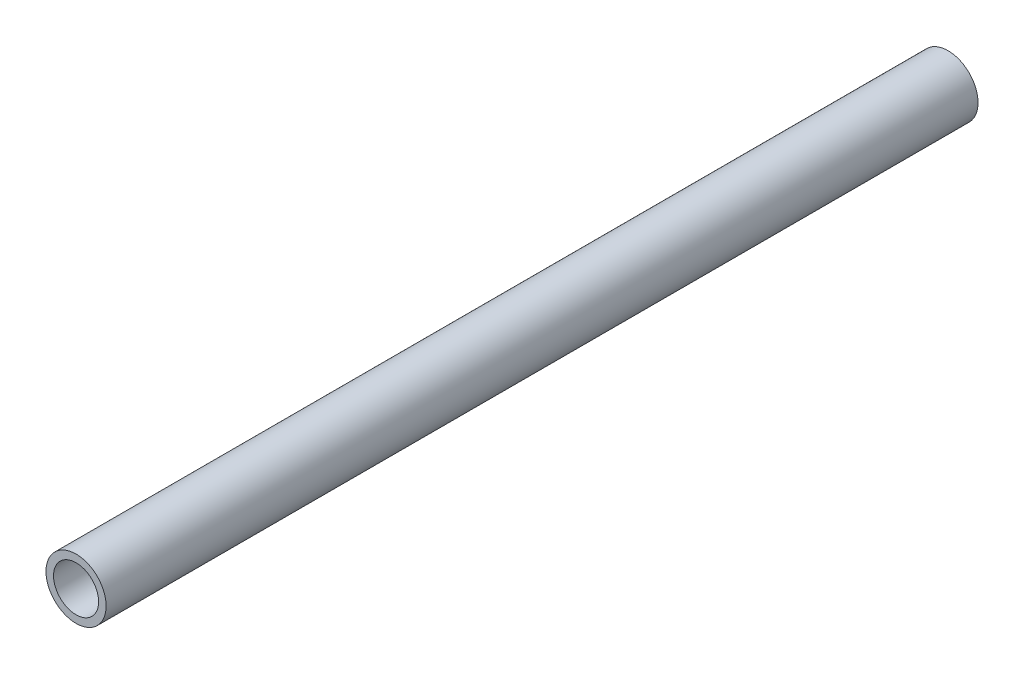
ISO-10303-21;
HEADER;
FILE_DESCRIPTION(('STEP AP214'),'2;1');
FILE_NAME('part.step','',(''),(''),'','','');
FILE_SCHEMA(('AUTOMOTIVE_DESIGN { 1 0 10303 214 1 1 1 1 }'));
ENDSEC;
DATA;
#1=APPLICATION_CONTEXT('core data for automotive mechanical design processes');
#2=APPLICATION_PROTOCOL_DEFINITION('international standard','automotive_design',2000,#1);
#3=PRODUCT_CONTEXT('',#1,'mechanical');
#4=PRODUCT('Part','Part','',(#3));
#5=PRODUCT_RELATED_PRODUCT_CATEGORY('part','',(#4));
#6=PRODUCT_DEFINITION_FORMATION('','',#4);
#7=PRODUCT_DEFINITION_CONTEXT('part definition',#1,'design');
#8=PRODUCT_DEFINITION('design','',#6,#7);
#9=PRODUCT_DEFINITION_SHAPE('','',#8);
#10=(LENGTH_UNIT() NAMED_UNIT(*) SI_UNIT(.MILLI.,.METRE.));
#11=(NAMED_UNIT(*) PLANE_ANGLE_UNIT() SI_UNIT($,.RADIAN.));
#12=(NAMED_UNIT(*) SI_UNIT($,.STERADIAN.) SOLID_ANGLE_UNIT());
#13=UNCERTAINTY_MEASURE_WITH_UNIT(LENGTH_MEASURE(1.E-05),#10,'distance_accuracy_value','');
#14=(GEOMETRIC_REPRESENTATION_CONTEXT(3) GLOBAL_UNCERTAINTY_ASSIGNED_CONTEXT((#13)) GLOBAL_UNIT_ASSIGNED_CONTEXT((#10,
#11,#12)) REPRESENTATION_CONTEXT('',''));
#15=CARTESIAN_POINT('',(0.,0.,0.));
#16=DIRECTION('',(0.,0.,1.));
#17=DIRECTION('',(1.,0.,0.));
#18=AXIS2_PLACEMENT_3D('',#15,#16,#17);
#19=CARTESIAN_POINT('',(0.,0.,29.));
#20=DIRECTION('',(0.,0.,1.));
#21=DIRECTION('',(1.,0.,0.));
#22=AXIS2_PLACEMENT_3D('',#19,#20,#21);
#23=PLANE('',#22);
#24=CARTESIAN_POINT('',(0.,0.,29.));
#25=DIRECTION('',(0.,0.,1.));
#26=DIRECTION('',(1.,0.,0.));
#27=AXIS2_PLACEMENT_3D('',#24,#25,#26);
#28=CIRCLE('',#27,2.);
#29=CARTESIAN_POINT('',(-2.,0.,29.));
#30=VERTEX_POINT('',#29);
#31=EDGE_CURVE('E10',#30,#30,#28,.T.);
#32=ORIENTED_EDGE('',*,*,#31,.T.);
#33=EDGE_LOOP('',(#32));
#34=FACE_BOUND('',#33,.T.);
#35=CARTESIAN_POINT('',(0.,0.,29.));
#36=DIRECTION('',(0.,0.,1.));
#37=DIRECTION('',(1.,0.,0.));
#38=AXIS2_PLACEMENT_3D('',#35,#36,#37);
#39=CIRCLE('',#38,1.5);
#40=CARTESIAN_POINT('',(-1.5,0.,29.));
#41=VERTEX_POINT('',#40);
#42=EDGE_CURVE('E43',#41,#41,#39,.T.);
#43=ORIENTED_EDGE('',*,*,#42,.F.);
#44=EDGE_LOOP('',(#43));
#45=FACE_BOUND('',#44,.T.);
#46=ADVANCED_FACE('F32',(#34,#45),#23,.T.);
#47=CARTESIAN_POINT('',(0.,0.,-29.));
#48=DIRECTION('',(0.,0.,1.));
#49=DIRECTION('',(1.,0.,0.));
#50=AXIS2_PLACEMENT_3D('',#47,#48,#49);
#51=PLANE('',#50);
#52=CARTESIAN_POINT('',(0.,0.,-29.));
#53=DIRECTION('',(0.,0.,1.));
#54=DIRECTION('',(1.,0.,0.));
#55=AXIS2_PLACEMENT_3D('',#52,#53,#54);
#56=CIRCLE('',#55,2.);
#57=CARTESIAN_POINT('',(-2.,0.,-29.));
#58=VERTEX_POINT('',#57);
#59=EDGE_CURVE('E36',#58,#58,#56,.T.);
#60=ORIENTED_EDGE('',*,*,#59,.F.);
#61=EDGE_LOOP('',(#60));
#62=FACE_BOUND('',#61,.T.);
#63=CARTESIAN_POINT('',(0.,0.,-29.));
#64=DIRECTION('',(0.,0.,1.));
#65=DIRECTION('',(1.,0.,0.));
#66=AXIS2_PLACEMENT_3D('',#63,#64,#65);
#67=CIRCLE('',#66,1.5);
#68=CARTESIAN_POINT('',(-1.5,0.,-29.));
#69=VERTEX_POINT('',#68);
#70=EDGE_CURVE('E45',#69,#69,#67,.T.);
#71=ORIENTED_EDGE('',*,*,#70,.T.);
#72=EDGE_LOOP('',(#71));
#73=FACE_BOUND('',#72,.T.);
#74=ADVANCED_FACE('F55',(#62,#73),#51,.F.);
#75=CARTESIAN_POINT('',(0.,0.,29.));
#76=DIRECTION('',(0.,0.,-1.));
#77=DIRECTION('',(-1.,0.,0.));
#78=AXIS2_PLACEMENT_3D('',#75,#76,#77);
#79=CYLINDRICAL_SURFACE('',#78,2.);
#80=CARTESIAN_POINT('',(-2.,0.,29.));
#81=CARTESIAN_POINT('',(-2.,0.,28.3958333333333));
#82=CARTESIAN_POINT('',(-2.,0.,27.7916666666667));
#83=CARTESIAN_POINT('',(-2.,0.,26.5833333333333));
#84=CARTESIAN_POINT('',(-2.,0.,25.9791666666667));
#85=CARTESIAN_POINT('',(-2.,0.,24.7708333333333));
#86=CARTESIAN_POINT('',(-2.,0.,24.1666666666667));
#87=CARTESIAN_POINT('',(-2.,0.,22.9583333333333));
#88=CARTESIAN_POINT('',(-2.,0.,22.3541666666667));
#89=CARTESIAN_POINT('',(-2.,0.,21.1458333333333));
#90=CARTESIAN_POINT('',(-2.,0.,20.5416666666667));
#91=CARTESIAN_POINT('',(-2.,0.,19.3333333333333));
#92=CARTESIAN_POINT('',(-2.,0.,18.7291666666667));
#93=CARTESIAN_POINT('',(-2.,0.,17.5208333333333));
#94=CARTESIAN_POINT('',(-2.,0.,16.9166666666667));
#95=CARTESIAN_POINT('',(-2.,0.,15.7083333333333));
#96=CARTESIAN_POINT('',(-2.,0.,15.1041666666667));
#97=CARTESIAN_POINT('',(-2.,0.,13.8958333333333));
#98=CARTESIAN_POINT('',(-2.,0.,13.2916666666667));
#99=CARTESIAN_POINT('',(-2.,0.,12.0833333333333));
#100=CARTESIAN_POINT('',(-2.,0.,11.4791666666667));
#101=CARTESIAN_POINT('',(-2.,0.,10.2708333333333));
#102=CARTESIAN_POINT('',(-2.,0.,9.66666666666667));
#103=CARTESIAN_POINT('',(-2.,0.,8.45833333333333));
#104=CARTESIAN_POINT('',(-2.,0.,7.85416666666667));
#105=CARTESIAN_POINT('',(-2.,0.,6.64583333333333));
#106=CARTESIAN_POINT('',(-2.,0.,6.04166666666667));
#107=CARTESIAN_POINT('',(-2.,0.,4.83333333333333));
#108=CARTESIAN_POINT('',(-2.,0.,4.22916666666667));
#109=CARTESIAN_POINT('',(-2.,0.,3.02083333333333));
#110=CARTESIAN_POINT('',(-2.,0.,2.41666666666667));
#111=CARTESIAN_POINT('',(-2.,0.,1.20833333333333));
#112=CARTESIAN_POINT('',(-2.,0.,0.604166666666667));
#113=CARTESIAN_POINT('',(-2.,0.,-0.604166666666667));
#114=CARTESIAN_POINT('',(-2.,0.,-1.20833333333333));
#115=CARTESIAN_POINT('',(-2.,0.,-2.41666666666667));
#116=CARTESIAN_POINT('',(-2.,0.,-3.02083333333333));
#117=CARTESIAN_POINT('',(-2.,0.,-4.22916666666667));
#118=CARTESIAN_POINT('',(-2.,0.,-4.83333333333333));
#119=CARTESIAN_POINT('',(-2.,0.,-6.04166666666666));
#120=CARTESIAN_POINT('',(-2.,0.,-6.64583333333333));
#121=CARTESIAN_POINT('',(-2.,0.,-7.85416666666666));
#122=CARTESIAN_POINT('',(-2.,0.,-8.45833333333333));
#123=CARTESIAN_POINT('',(-2.,0.,-9.66666666666667));
#124=CARTESIAN_POINT('',(-2.,0.,-10.2708333333333));
#125=CARTESIAN_POINT('',(-2.,0.,-11.4791666666667));
#126=CARTESIAN_POINT('',(-2.,0.,-12.0833333333333));
#127=CARTESIAN_POINT('',(-2.,0.,-13.2916666666667));
#128=CARTESIAN_POINT('',(-2.,0.,-13.8958333333333));
#129=CARTESIAN_POINT('',(-2.,0.,-15.1041666666667));
#130=CARTESIAN_POINT('',(-2.,0.,-15.7083333333333));
#131=CARTESIAN_POINT('',(-2.,0.,-16.9166666666667));
#132=CARTESIAN_POINT('',(-2.,0.,-17.5208333333333));
#133=CARTESIAN_POINT('',(-2.,0.,-18.7291666666667));
#134=CARTESIAN_POINT('',(-2.,0.,-19.3333333333333));
#135=CARTESIAN_POINT('',(-2.,0.,-20.5416666666667));
#136=CARTESIAN_POINT('',(-2.,0.,-21.1458333333333));
#137=CARTESIAN_POINT('',(-2.,0.,-22.3541666666667));
#138=CARTESIAN_POINT('',(-2.,0.,-22.9583333333333));
#139=CARTESIAN_POINT('',(-2.,0.,-24.1666666666667));
#140=CARTESIAN_POINT('',(-2.,0.,-24.7708333333333));
#141=CARTESIAN_POINT('',(-2.,0.,-25.9791666666667));
#142=CARTESIAN_POINT('',(-2.,0.,-26.5833333333333));
#143=CARTESIAN_POINT('',(-2.,0.,-27.7916666666667));
#144=CARTESIAN_POINT('',(-2.,0.,-28.3958333333333));
#145=CARTESIAN_POINT('',(-2.,0.,-29.));
#146=B_SPLINE_CURVE_WITH_KNOTS('',3,(#80,#81,#82,#83,#84,#85,#86,#87,#88,#89,#90,#91,#92,#93,
#94,#95,#96,#97,#98,#99,#100,#101,#102,#103,#104,#105,#106,#107,#108,#109,#110,#111,#112,#113,
#114,#115,#116,#117,#118,#119,#120,#121,#122,#123,#124,#125,#126,#127,#128,#129,#130,#131,#132,
#133,#134,#135,#136,#137,#138,#139,#140,#141,#142,#143,#144,#145),.UNSPECIFIED.,.F.,.F.,(4,2,2,
2,2,2,2,2,2,2,2,2,2,2,2,2,2,2,2,2,2,2,2,2,2,2,2,2,2,2,2,2,4),(0.,1.8125,3.625,5.4375,7.25,
9.0625,10.875,12.6875,14.5,16.3125,18.125,19.9375,21.75,23.5625,25.375,27.1875,29.,30.8125,
32.625,34.4375,36.25,38.0625,39.875,41.6875,43.5,45.3125,47.125,48.9375,50.75,52.5625,54.375,
56.1875,58.),.UNSPECIFIED.);
#147=EDGE_CURVE('BSEAM34',#30,#58,#146,.T.);
#148=ORIENTED_EDGE('',*,*,#31,.F.);
#149=ORIENTED_EDGE('',*,*,#59,.T.);
#150=ORIENTED_EDGE('',*,*,#147,.T.);
#151=ORIENTED_EDGE('',*,*,#147,.F.);
#152=EDGE_LOOP('',(#148,#150,#149,#151));
#153=FACE_BOUND('',#152,.T.);
#154=ADVANCED_FACE('F34',(#153),#79,.T.);
#155=CARTESIAN_POINT('',(0.,0.,29.));
#156=DIRECTION('',(0.,0.,-1.));
#157=DIRECTION('',(-1.,0.,0.));
#158=AXIS2_PLACEMENT_3D('',#155,#156,#157);
#159=CYLINDRICAL_SURFACE('',#158,1.5);
#160=CARTESIAN_POINT('',(-1.5,0.,29.));
#161=CARTESIAN_POINT('',(-1.5,0.,28.3958333333333));
#162=CARTESIAN_POINT('',(-1.5,0.,27.7916666666667));
#163=CARTESIAN_POINT('',(-1.5,0.,26.5833333333333));
#164=CARTESIAN_POINT('',(-1.5,0.,25.9791666666667));
#165=CARTESIAN_POINT('',(-1.5,0.,24.7708333333333));
#166=CARTESIAN_POINT('',(-1.5,0.,24.1666666666667));
#167=CARTESIAN_POINT('',(-1.5,0.,22.9583333333333));
#168=CARTESIAN_POINT('',(-1.5,0.,22.3541666666667));
#169=CARTESIAN_POINT('',(-1.5,0.,21.1458333333333));
#170=CARTESIAN_POINT('',(-1.5,0.,20.5416666666667));
#171=CARTESIAN_POINT('',(-1.5,0.,19.3333333333333));
#172=CARTESIAN_POINT('',(-1.5,0.,18.7291666666667));
#173=CARTESIAN_POINT('',(-1.5,0.,17.5208333333333));
#174=CARTESIAN_POINT('',(-1.5,0.,16.9166666666667));
#175=CARTESIAN_POINT('',(-1.5,0.,15.7083333333333));
#176=CARTESIAN_POINT('',(-1.5,0.,15.1041666666667));
#177=CARTESIAN_POINT('',(-1.5,0.,13.8958333333333));
#178=CARTESIAN_POINT('',(-1.5,0.,13.2916666666667));
#179=CARTESIAN_POINT('',(-1.5,0.,12.0833333333333));
#180=CARTESIAN_POINT('',(-1.5,0.,11.4791666666667));
#181=CARTESIAN_POINT('',(-1.5,0.,10.2708333333333));
#182=CARTESIAN_POINT('',(-1.5,0.,9.66666666666667));
#183=CARTESIAN_POINT('',(-1.5,0.,8.45833333333333));
#184=CARTESIAN_POINT('',(-1.5,0.,7.85416666666666));
#185=CARTESIAN_POINT('',(-1.5,0.,6.64583333333333));
#186=CARTESIAN_POINT('',(-1.5,0.,6.04166666666666));
#187=CARTESIAN_POINT('',(-1.5,0.,4.83333333333333));
#188=CARTESIAN_POINT('',(-1.5,0.,4.22916666666666));
#189=CARTESIAN_POINT('',(-1.5,0.,3.02083333333333));
#190=CARTESIAN_POINT('',(-1.5,0.,2.41666666666666));
#191=CARTESIAN_POINT('',(-1.5,0.,1.20833333333333));
#192=CARTESIAN_POINT('',(-1.5,0.,0.604166666666664));
#193=CARTESIAN_POINT('',(-1.5,0.,-0.604166666666671));
#194=CARTESIAN_POINT('',(-1.5,0.,-1.20833333333334));
#195=CARTESIAN_POINT('',(-1.5,0.,-2.41666666666667));
#196=CARTESIAN_POINT('',(-1.5,0.,-3.02083333333333));
#197=CARTESIAN_POINT('',(-1.5,0.,-4.22916666666667));
#198=CARTESIAN_POINT('',(-1.5,0.,-4.83333333333333));
#199=CARTESIAN_POINT('',(-1.5,0.,-6.04166666666666));
#200=CARTESIAN_POINT('',(-1.5,0.,-6.64583333333333));
#201=CARTESIAN_POINT('',(-1.5,0.,-7.85416666666666));
#202=CARTESIAN_POINT('',(-1.5,0.,-8.45833333333333));
#203=CARTESIAN_POINT('',(-1.5,0.,-9.66666666666667));
#204=CARTESIAN_POINT('',(-1.5,0.,-10.2708333333333));
#205=CARTESIAN_POINT('',(-1.5,0.,-11.4791666666667));
#206=CARTESIAN_POINT('',(-1.5,0.,-12.0833333333333));
#207=CARTESIAN_POINT('',(-1.5,0.,-13.2916666666667));
#208=CARTESIAN_POINT('',(-1.5,0.,-13.8958333333333));
#209=CARTESIAN_POINT('',(-1.5,0.,-15.1041666666667));
#210=CARTESIAN_POINT('',(-1.5,0.,-15.7083333333333));
#211=CARTESIAN_POINT('',(-1.5,0.,-16.9166666666667));
#212=CARTESIAN_POINT('',(-1.5,0.,-17.5208333333333));
#213=CARTESIAN_POINT('',(-1.5,0.,-18.7291666666667));
#214=CARTESIAN_POINT('',(-1.5,0.,-19.3333333333333));
#215=CARTESIAN_POINT('',(-1.5,0.,-20.5416666666667));
#216=CARTESIAN_POINT('',(-1.5,0.,-21.1458333333333));
#217=CARTESIAN_POINT('',(-1.5,0.,-22.3541666666667));
#218=CARTESIAN_POINT('',(-1.5,0.,-22.9583333333333));
#219=CARTESIAN_POINT('',(-1.5,0.,-24.1666666666667));
#220=CARTESIAN_POINT('',(-1.5,0.,-24.7708333333333));
#221=CARTESIAN_POINT('',(-1.5,0.,-25.9791666666667));
#222=CARTESIAN_POINT('',(-1.5,0.,-26.5833333333333));
#223=CARTESIAN_POINT('',(-1.5,0.,-27.7916666666667));
#224=CARTESIAN_POINT('',(-1.5,0.,-28.3958333333333));
#225=CARTESIAN_POINT('',(-1.5,0.,-29.));
#226=B_SPLINE_CURVE_WITH_KNOTS('',3,(#160,#161,#162,#163,#164,#165,#166,#167,#168,#169,#170,
#171,#172,#173,#174,#175,#176,#177,#178,#179,#180,#181,#182,#183,#184,#185,#186,#187,#188,#189,
#190,#191,#192,#193,#194,#195,#196,#197,#198,#199,#200,#201,#202,#203,#204,#205,#206,#207,#208,
#209,#210,#211,#212,#213,#214,#215,#216,#217,#218,#219,#220,#221,#222,#223,#224,#225),
.UNSPECIFIED.,.F.,.F.,(4,2,2,2,2,2,2,2,2,2,2,2,2,2,2,2,2,2,2,2,2,2,2,2,2,2,2,2,2,2,2,2,4),(0.,
1.8125,3.625,5.4375,7.25,9.0625,10.875,12.6875,14.5,16.3125,18.125,19.9375,21.75,23.5625,25.375,
27.1875,29.,30.8125,32.625,34.4375,36.25,38.0625,39.875,41.6875,43.5,45.3125,47.125,48.9375,
50.75,52.5625,54.375,56.1875,58.),.UNSPECIFIED.);
#227=EDGE_CURVE('BSEAM51',#41,#69,#226,.T.);
#228=ORIENTED_EDGE('',*,*,#42,.T.);
#229=ORIENTED_EDGE('',*,*,#70,.F.);
#230=ORIENTED_EDGE('',*,*,#227,.T.);
#231=ORIENTED_EDGE('',*,*,#227,.F.);
#232=EDGE_LOOP('',(#228,#230,#229,#231));
#233=FACE_BOUND('',#232,.T.);
#234=ADVANCED_FACE('F51',(#233),#159,.F.);
#235=CLOSED_SHELL('',(#46,#74,#154,#234));
#236=MANIFOLD_SOLID_BREP('B2',#235);
#237=ADVANCED_BREP_SHAPE_REPRESENTATION('',(#18,#236),#14);
#238=SHAPE_DEFINITION_REPRESENTATION(#9,#237);
ENDSEC;
END-ISO-10303-21;
